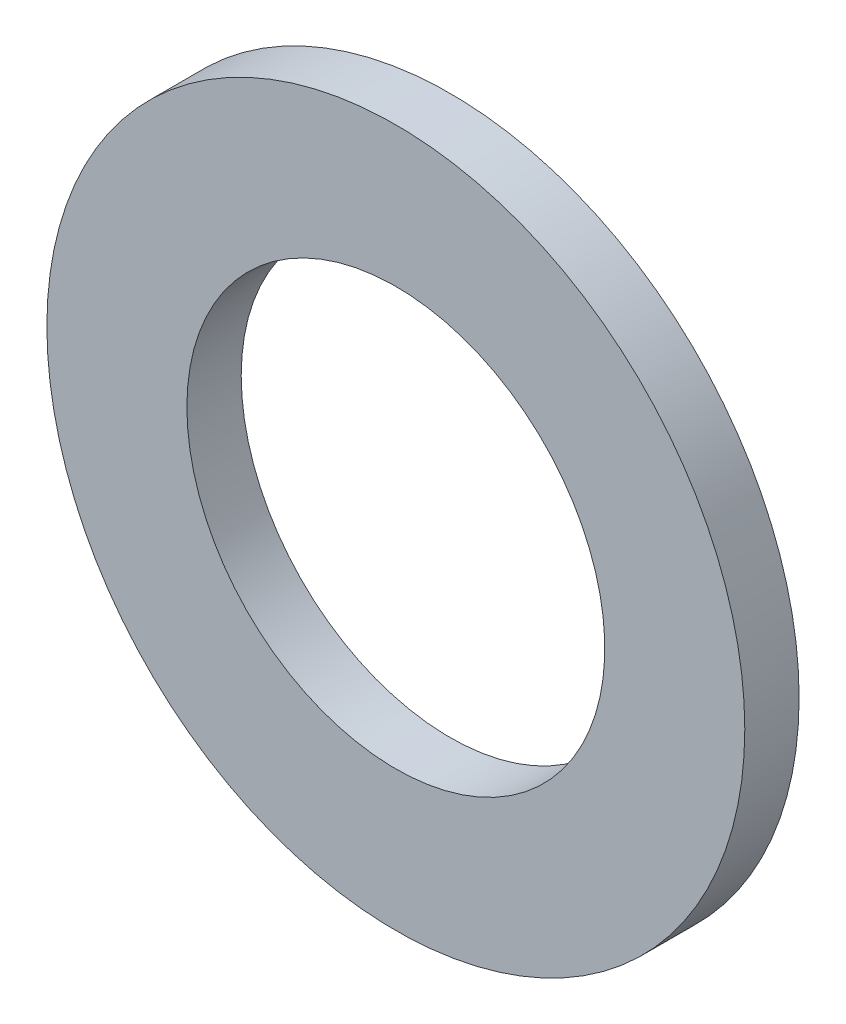
ISO-10303-21;
HEADER;
FILE_DESCRIPTION(('STEP AP214'),'2;1');
FILE_NAME('part.step','',(''),(''),'','','');
FILE_SCHEMA(('AUTOMOTIVE_DESIGN { 1 0 10303 214 1 1 1 1 }'));
ENDSEC;
DATA;
#1=APPLICATION_CONTEXT('core data for automotive mechanical design processes');
#2=APPLICATION_PROTOCOL_DEFINITION('international standard','automotive_design',2000,#1);
#3=PRODUCT_CONTEXT('',#1,'mechanical');
#4=PRODUCT('Part','Part','',(#3));
#5=PRODUCT_RELATED_PRODUCT_CATEGORY('part','',(#4));
#6=PRODUCT_DEFINITION_FORMATION('','',#4);
#7=PRODUCT_DEFINITION_CONTEXT('part definition',#1,'design');
#8=PRODUCT_DEFINITION('design','',#6,#7);
#9=PRODUCT_DEFINITION_SHAPE('','',#8);
#10=(LENGTH_UNIT() NAMED_UNIT(*) SI_UNIT(.MILLI.,.METRE.));
#11=(NAMED_UNIT(*) PLANE_ANGLE_UNIT() SI_UNIT($,.RADIAN.));
#12=(NAMED_UNIT(*) SI_UNIT($,.STERADIAN.) SOLID_ANGLE_UNIT());
#13=UNCERTAINTY_MEASURE_WITH_UNIT(LENGTH_MEASURE(1.E-05),#10,'distance_accuracy_value','');
#14=(GEOMETRIC_REPRESENTATION_CONTEXT(3) GLOBAL_UNCERTAINTY_ASSIGNED_CONTEXT((#13)) GLOBAL_UNIT_ASSIGNED_CONTEXT((#10,
#11,#12)) REPRESENTATION_CONTEXT('',''));
#15=CARTESIAN_POINT('',(0.,0.,0.));
#16=DIRECTION('',(0.,0.,1.));
#17=DIRECTION('',(1.,0.,0.));
#18=AXIS2_PLACEMENT_3D('',#15,#16,#17);
#19=CARTESIAN_POINT('',(0.,0.,3.302));
#20=DIRECTION('',(0.,0.,1.));
#21=DIRECTION('',(1.,0.,0.));
#22=AXIS2_PLACEMENT_3D('',#19,#20,#21);
#23=PLANE('',#22);
#24=CARTESIAN_POINT('',(0.,0.,3.302));
#25=DIRECTION('',(0.,0.,1.));
#26=DIRECTION('',(1.,0.,0.));
#27=AXIS2_PLACEMENT_3D('',#24,#25,#26);
#28=CIRCLE('',#27,21.209);
#29=CARTESIAN_POINT('',(-21.209,0.,3.302));
#30=VERTEX_POINT('',#29);
#31=EDGE_CURVE('E10',#30,#30,#28,.T.);
#32=ORIENTED_EDGE('',*,*,#31,.T.);
#33=EDGE_LOOP('',(#32));
#34=FACE_BOUND('',#33,.T.);
#35=CARTESIAN_POINT('',(0.,0.,3.302));
#36=DIRECTION('',(0.,0.,1.));
#37=DIRECTION('',(1.,0.,0.));
#38=AXIS2_PLACEMENT_3D('',#35,#36,#37);
#39=CIRCLE('',#38,12.7);
#40=CARTESIAN_POINT('',(-12.7,0.,3.302));
#41=VERTEX_POINT('',#40);
#42=EDGE_CURVE('E43',#41,#41,#39,.T.);
#43=ORIENTED_EDGE('',*,*,#42,.F.);
#44=EDGE_LOOP('',(#43));
#45=FACE_BOUND('',#44,.T.);
#46=ADVANCED_FACE('F32',(#34,#45),#23,.T.);
#47=CARTESIAN_POINT('',(0.,0.,0.));
#48=DIRECTION('',(0.,0.,1.));
#49=DIRECTION('',(1.,0.,0.));
#50=AXIS2_PLACEMENT_3D('',#47,#48,#49);
#51=PLANE('',#50);
#52=CARTESIAN_POINT('',(0.,0.,0.));
#53=DIRECTION('',(0.,0.,1.));
#54=DIRECTION('',(1.,0.,0.));
#55=AXIS2_PLACEMENT_3D('',#52,#53,#54);
#56=CIRCLE('',#55,21.209);
#57=CARTESIAN_POINT('',(-21.209,0.,0.));
#58=VERTEX_POINT('',#57);
#59=EDGE_CURVE('E36',#58,#58,#56,.T.);
#60=ORIENTED_EDGE('',*,*,#59,.F.);
#61=EDGE_LOOP('',(#60));
#62=FACE_BOUND('',#61,.T.);
#63=CARTESIAN_POINT('',(0.,0.,0.));
#64=DIRECTION('',(0.,0.,1.));
#65=DIRECTION('',(1.,0.,0.));
#66=AXIS2_PLACEMENT_3D('',#63,#64,#65);
#67=CIRCLE('',#66,12.7);
#68=CARTESIAN_POINT('',(-12.7,0.,0.));
#69=VERTEX_POINT('',#68);
#70=EDGE_CURVE('E45',#69,#69,#67,.T.);
#71=ORIENTED_EDGE('',*,*,#70,.T.);
#72=EDGE_LOOP('',(#71));
#73=FACE_BOUND('',#72,.T.);
#74=ADVANCED_FACE('F55',(#62,#73),#51,.F.);
#75=CARTESIAN_POINT('',(0.,0.,3.302));
#76=DIRECTION('',(0.,0.,-1.));
#77=DIRECTION('',(-1.,0.,0.));
#78=AXIS2_PLACEMENT_3D('',#75,#76,#77);
#79=CYLINDRICAL_SURFACE('',#78,21.209);
#80=CARTESIAN_POINT('',(-21.209,0.,3.302));
#81=CARTESIAN_POINT('',(-21.209,0.,3.26760416666667));
#82=CARTESIAN_POINT('',(-21.209,0.,3.23320833333333));
#83=CARTESIAN_POINT('',(-21.209,0.,3.16441666666667));
#84=CARTESIAN_POINT('',(-21.209,0.,3.13002083333333));
#85=CARTESIAN_POINT('',(-21.209,0.,3.06122916666667));
#86=CARTESIAN_POINT('',(-21.209,0.,3.02683333333333));
#87=CARTESIAN_POINT('',(-21.209,0.,2.95804166666667));
#88=CARTESIAN_POINT('',(-21.209,0.,2.92364583333333));
#89=CARTESIAN_POINT('',(-21.209,0.,2.85485416666667));
#90=CARTESIAN_POINT('',(-21.209,0.,2.82045833333333));
#91=CARTESIAN_POINT('',(-21.209,0.,2.75166666666667));
#92=CARTESIAN_POINT('',(-21.209,0.,2.71727083333333));
#93=CARTESIAN_POINT('',(-21.209,0.,2.64847916666667));
#94=CARTESIAN_POINT('',(-21.209,0.,2.61408333333333));
#95=CARTESIAN_POINT('',(-21.209,0.,2.54529166666667));
#96=CARTESIAN_POINT('',(-21.209,0.,2.51089583333333));
#97=CARTESIAN_POINT('',(-21.209,0.,2.44210416666667));
#98=CARTESIAN_POINT('',(-21.209,0.,2.40770833333333));
#99=CARTESIAN_POINT('',(-21.209,0.,2.33891666666667));
#100=CARTESIAN_POINT('',(-21.209,0.,2.30452083333333));
#101=CARTESIAN_POINT('',(-21.209,0.,2.23572916666667));
#102=CARTESIAN_POINT('',(-21.209,0.,2.20133333333333));
#103=CARTESIAN_POINT('',(-21.209,0.,2.13254166666667));
#104=CARTESIAN_POINT('',(-21.209,0.,2.09814583333333));
#105=CARTESIAN_POINT('',(-21.209,0.,2.02935416666667));
#106=CARTESIAN_POINT('',(-21.209,0.,1.99495833333333));
#107=CARTESIAN_POINT('',(-21.209,0.,1.92616666666667));
#108=CARTESIAN_POINT('',(-21.209,0.,1.89177083333333));
#109=CARTESIAN_POINT('',(-21.209,0.,1.82297916666667));
#110=CARTESIAN_POINT('',(-21.209,0.,1.78858333333333));
#111=CARTESIAN_POINT('',(-21.209,0.,1.71979166666667));
#112=CARTESIAN_POINT('',(-21.209,0.,1.68539583333333));
#113=CARTESIAN_POINT('',(-21.209,0.,1.61660416666667));
#114=CARTESIAN_POINT('',(-21.209,0.,1.58220833333333));
#115=CARTESIAN_POINT('',(-21.209,0.,1.51341666666667));
#116=CARTESIAN_POINT('',(-21.209,0.,1.47902083333333));
#117=CARTESIAN_POINT('',(-21.209,0.,1.41022916666667));
#118=CARTESIAN_POINT('',(-21.209,0.,1.37583333333333));
#119=CARTESIAN_POINT('',(-21.209,0.,1.30704166666667));
#120=CARTESIAN_POINT('',(-21.209,0.,1.27264583333333));
#121=CARTESIAN_POINT('',(-21.209,0.,1.20385416666667));
#122=CARTESIAN_POINT('',(-21.209,0.,1.16945833333333));
#123=CARTESIAN_POINT('',(-21.209,0.,1.10066666666667));
#124=CARTESIAN_POINT('',(-21.209,0.,1.06627083333333));
#125=CARTESIAN_POINT('',(-21.209,0.,0.997479166666666));
#126=CARTESIAN_POINT('',(-21.209,0.,0.963083333333333));
#127=CARTESIAN_POINT('',(-21.209,0.,0.894291666666666));
#128=CARTESIAN_POINT('',(-21.209,0.,0.859895833333333));
#129=CARTESIAN_POINT('',(-21.209,0.,0.791104166666666));
#130=CARTESIAN_POINT('',(-21.209,0.,0.756708333333333));
#131=CARTESIAN_POINT('',(-21.209,0.,0.687916666666667));
#132=CARTESIAN_POINT('',(-21.209,0.,0.653520833333333));
#133=CARTESIAN_POINT('',(-21.209,0.,0.584729166666667));
#134=CARTESIAN_POINT('',(-21.209,0.,0.550333333333333));
#135=CARTESIAN_POINT('',(-21.209,0.,0.481541666666667));
#136=CARTESIAN_POINT('',(-21.209,0.,0.447145833333333));
#137=CARTESIAN_POINT('',(-21.209,0.,0.378354166666667));
#138=CARTESIAN_POINT('',(-21.209,0.,0.343958333333333));
#139=CARTESIAN_POINT('',(-21.209,0.,0.275166666666667));
#140=CARTESIAN_POINT('',(-21.209,0.,0.240770833333333));
#141=CARTESIAN_POINT('',(-21.209,0.,0.171979166666667));
#142=CARTESIAN_POINT('',(-21.209,0.,0.137583333333333));
#143=CARTESIAN_POINT('',(-21.209,0.,0.0687916666666666));
#144=CARTESIAN_POINT('',(-21.209,0.,0.0343958333333333));
#145=CARTESIAN_POINT('',(-21.209,0.,0.));
#146=B_SPLINE_CURVE_WITH_KNOTS('',3,(#80,#81,#82,#83,#84,#85,#86,#87,#88,#89,#90,#91,#92,#93,
#94,#95,#96,#97,#98,#99,#100,#101,#102,#103,#104,#105,#106,#107,#108,#109,#110,#111,#112,#113,
#114,#115,#116,#117,#118,#119,#120,#121,#122,#123,#124,#125,#126,#127,#128,#129,#130,#131,#132,
#133,#134,#135,#136,#137,#138,#139,#140,#141,#142,#143,#144,#145),.UNSPECIFIED.,.F.,.F.,(4,2,2,
2,2,2,2,2,2,2,2,2,2,2,2,2,2,2,2,2,2,2,2,2,2,2,2,2,2,2,2,2,4),(0.,0.1031875,0.206375,0.3095625,
0.41275,0.5159375,0.619125,0.7223125,0.8255,0.9286875,1.031875,1.1350625,1.23825,1.3414375,
1.444625,1.5478125,1.651,1.7541875,1.857375,1.9605625,2.06375,2.1669375,2.270125,2.3733125,
2.4765,2.5796875,2.682875,2.7860625,2.88925,2.9924375,3.095625,3.1988125,3.302),.UNSPECIFIED.);
#147=EDGE_CURVE('BSEAM34',#30,#58,#146,.T.);
#148=ORIENTED_EDGE('',*,*,#31,.F.);
#149=ORIENTED_EDGE('',*,*,#59,.T.);
#150=ORIENTED_EDGE('',*,*,#147,.T.);
#151=ORIENTED_EDGE('',*,*,#147,.F.);
#152=EDGE_LOOP('',(#148,#150,#149,#151));
#153=FACE_BOUND('',#152,.T.);
#154=ADVANCED_FACE('F34',(#153),#79,.T.);
#155=CARTESIAN_POINT('',(0.,0.,3.302));
#156=DIRECTION('',(0.,0.,-1.));
#157=DIRECTION('',(-1.,0.,0.));
#158=AXIS2_PLACEMENT_3D('',#155,#156,#157);
#159=CYLINDRICAL_SURFACE('',#158,12.7);
#160=CARTESIAN_POINT('',(-12.7,0.,3.302));
#161=CARTESIAN_POINT('',(-12.7,0.,3.26760416666667));
#162=CARTESIAN_POINT('',(-12.7,0.,3.23320833333333));
#163=CARTESIAN_POINT('',(-12.7,0.,3.16441666666667));
#164=CARTESIAN_POINT('',(-12.7,0.,3.13002083333333));
#165=CARTESIAN_POINT('',(-12.7,0.,3.06122916666667));
#166=CARTESIAN_POINT('',(-12.7,0.,3.02683333333333));
#167=CARTESIAN_POINT('',(-12.7,0.,2.95804166666667));
#168=CARTESIAN_POINT('',(-12.7,0.,2.92364583333333));
#169=CARTESIAN_POINT('',(-12.7,0.,2.85485416666667));
#170=CARTESIAN_POINT('',(-12.7,0.,2.82045833333333));
#171=CARTESIAN_POINT('',(-12.7,0.,2.75166666666667));
#172=CARTESIAN_POINT('',(-12.7,0.,2.71727083333333));
#173=CARTESIAN_POINT('',(-12.7,0.,2.64847916666667));
#174=CARTESIAN_POINT('',(-12.7,0.,2.61408333333333));
#175=CARTESIAN_POINT('',(-12.7,0.,2.54529166666667));
#176=CARTESIAN_POINT('',(-12.7,0.,2.51089583333333));
#177=CARTESIAN_POINT('',(-12.7,0.,2.44210416666667));
#178=CARTESIAN_POINT('',(-12.7,0.,2.40770833333333));
#179=CARTESIAN_POINT('',(-12.7,0.,2.33891666666667));
#180=CARTESIAN_POINT('',(-12.7,0.,2.30452083333333));
#181=CARTESIAN_POINT('',(-12.7,0.,2.23572916666667));
#182=CARTESIAN_POINT('',(-12.7,0.,2.20133333333333));
#183=CARTESIAN_POINT('',(-12.7,0.,2.13254166666667));
#184=CARTESIAN_POINT('',(-12.7,0.,2.09814583333333));
#185=CARTESIAN_POINT('',(-12.7,0.,2.02935416666667));
#186=CARTESIAN_POINT('',(-12.7,0.,1.99495833333333));
#187=CARTESIAN_POINT('',(-12.7,0.,1.92616666666667));
#188=CARTESIAN_POINT('',(-12.7,0.,1.89177083333333));
#189=CARTESIAN_POINT('',(-12.7,0.,1.82297916666667));
#190=CARTESIAN_POINT('',(-12.7,0.,1.78858333333333));
#191=CARTESIAN_POINT('',(-12.7,0.,1.71979166666667));
#192=CARTESIAN_POINT('',(-12.7,0.,1.68539583333333));
#193=CARTESIAN_POINT('',(-12.7,0.,1.61660416666667));
#194=CARTESIAN_POINT('',(-12.7,0.,1.58220833333333));
#195=CARTESIAN_POINT('',(-12.7,0.,1.51341666666667));
#196=CARTESIAN_POINT('',(-12.7,0.,1.47902083333333));
#197=CARTESIAN_POINT('',(-12.7,0.,1.41022916666667));
#198=CARTESIAN_POINT('',(-12.7,0.,1.37583333333333));
#199=CARTESIAN_POINT('',(-12.7,0.,1.30704166666667));
#200=CARTESIAN_POINT('',(-12.7,0.,1.27264583333333));
#201=CARTESIAN_POINT('',(-12.7,0.,1.20385416666667));
#202=CARTESIAN_POINT('',(-12.7,0.,1.16945833333333));
#203=CARTESIAN_POINT('',(-12.7,0.,1.10066666666667));
#204=CARTESIAN_POINT('',(-12.7,0.,1.06627083333333));
#205=CARTESIAN_POINT('',(-12.7,0.,0.997479166666666));
#206=CARTESIAN_POINT('',(-12.7,0.,0.963083333333333));
#207=CARTESIAN_POINT('',(-12.7,0.,0.894291666666666));
#208=CARTESIAN_POINT('',(-12.7,0.,0.859895833333333));
#209=CARTESIAN_POINT('',(-12.7,0.,0.791104166666666));
#210=CARTESIAN_POINT('',(-12.7,0.,0.756708333333333));
#211=CARTESIAN_POINT('',(-12.7,0.,0.687916666666667));
#212=CARTESIAN_POINT('',(-12.7,0.,0.653520833333333));
#213=CARTESIAN_POINT('',(-12.7,0.,0.584729166666667));
#214=CARTESIAN_POINT('',(-12.7,0.,0.550333333333333));
#215=CARTESIAN_POINT('',(-12.7,0.,0.481541666666667));
#216=CARTESIAN_POINT('',(-12.7,0.,0.447145833333333));
#217=CARTESIAN_POINT('',(-12.7,0.,0.378354166666667));
#218=CARTESIAN_POINT('',(-12.7,0.,0.343958333333333));
#219=CARTESIAN_POINT('',(-12.7,0.,0.275166666666667));
#220=CARTESIAN_POINT('',(-12.7,0.,0.240770833333333));
#221=CARTESIAN_POINT('',(-12.7,0.,0.171979166666667));
#222=CARTESIAN_POINT('',(-12.7,0.,0.137583333333333));
#223=CARTESIAN_POINT('',(-12.7,0.,0.0687916666666666));
#224=CARTESIAN_POINT('',(-12.7,0.,0.0343958333333333));
#225=CARTESIAN_POINT('',(-12.7,0.,0.));
#226=B_SPLINE_CURVE_WITH_KNOTS('',3,(#160,#161,#162,#163,#164,#165,#166,#167,#168,#169,#170,
#171,#172,#173,#174,#175,#176,#177,#178,#179,#180,#181,#182,#183,#184,#185,#186,#187,#188,#189,
#190,#191,#192,#193,#194,#195,#196,#197,#198,#199,#200,#201,#202,#203,#204,#205,#206,#207,#208,
#209,#210,#211,#212,#213,#214,#215,#216,#217,#218,#219,#220,#221,#222,#223,#224,#225),
.UNSPECIFIED.,.F.,.F.,(4,2,2,2,2,2,2,2,2,2,2,2,2,2,2,2,2,2,2,2,2,2,2,2,2,2,2,2,2,2,2,2,4),(0.,
0.1031875,0.206375,0.3095625,0.41275,0.5159375,0.619125,0.7223125,0.8255,0.9286875,1.031875,
1.1350625,1.23825,1.3414375,1.444625,1.5478125,1.651,1.7541875,1.857375,1.9605625,2.06375,
2.1669375,2.270125,2.3733125,2.4765,2.5796875,2.682875,2.7860625,2.88925,2.9924375,3.095625,
3.1988125,3.302),.UNSPECIFIED.);
#227=EDGE_CURVE('BSEAM51',#41,#69,#226,.T.);
#228=ORIENTED_EDGE('',*,*,#42,.T.);
#229=ORIENTED_EDGE('',*,*,#70,.F.);
#230=ORIENTED_EDGE('',*,*,#227,.T.);
#231=ORIENTED_EDGE('',*,*,#227,.F.);
#232=EDGE_LOOP('',(#228,#230,#229,#231));
#233=FACE_BOUND('',#232,.T.);
#234=ADVANCED_FACE('F51',(#233),#159,.F.);
#235=CLOSED_SHELL('',(#46,#74,#154,#234));
#236=MANIFOLD_SOLID_BREP('B2',#235);
#237=ADVANCED_BREP_SHAPE_REPRESENTATION('',(#18,#236),#14);
#238=SHAPE_DEFINITION_REPRESENTATION(#9,#237);
ENDSEC;
END-ISO-10303-21;
